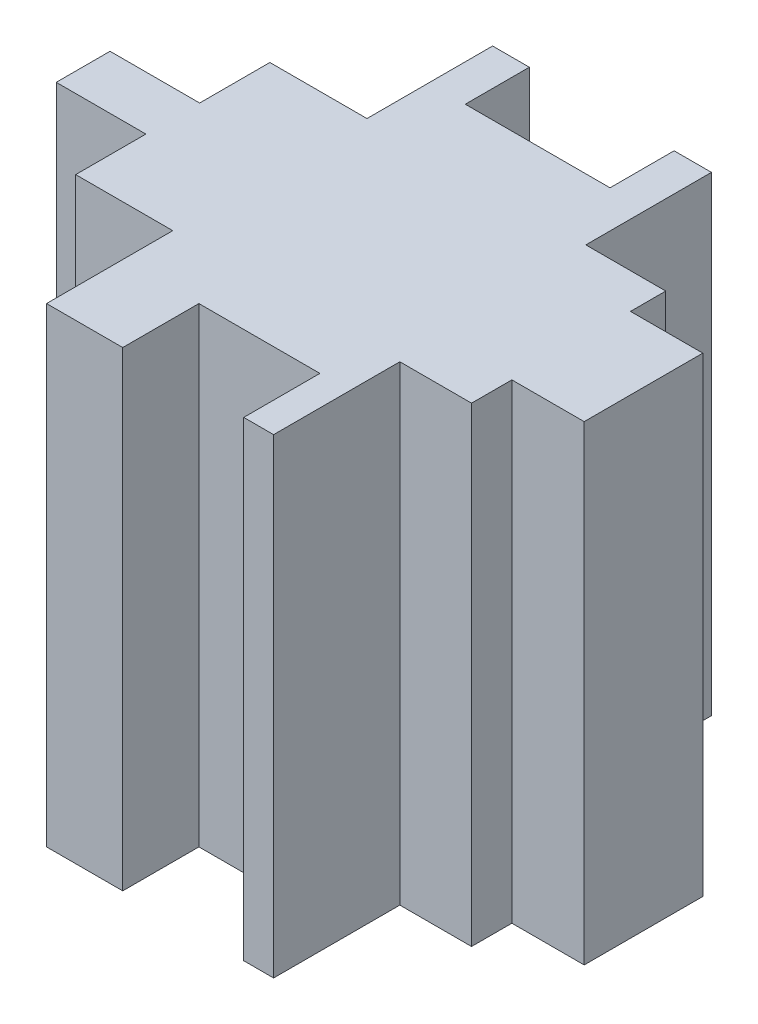
ISO-10303-21;
HEADER;
FILE_DESCRIPTION(('STEP AP214'),'2;1');
FILE_NAME('part.step','',(''),(''),'','','');
FILE_SCHEMA(('AUTOMOTIVE_DESIGN { 1 0 10303 214 1 1 1 1 }'));
ENDSEC;
DATA;
#1=APPLICATION_CONTEXT('core data for automotive mechanical design processes');
#2=APPLICATION_PROTOCOL_DEFINITION('international standard','automotive_design',2000,#1);
#3=PRODUCT_CONTEXT('',#1,'mechanical');
#4=PRODUCT('Part','Part','',(#3));
#5=PRODUCT_RELATED_PRODUCT_CATEGORY('part','',(#4));
#6=PRODUCT_DEFINITION_FORMATION('','',#4);
#7=PRODUCT_DEFINITION_CONTEXT('part definition',#1,'design');
#8=PRODUCT_DEFINITION('design','',#6,#7);
#9=PRODUCT_DEFINITION_SHAPE('','',#8);
#10=(LENGTH_UNIT() NAMED_UNIT(*) SI_UNIT(.MILLI.,.METRE.));
#11=(NAMED_UNIT(*) PLANE_ANGLE_UNIT() SI_UNIT($,.RADIAN.));
#12=(NAMED_UNIT(*) SI_UNIT($,.STERADIAN.) SOLID_ANGLE_UNIT());
#13=UNCERTAINTY_MEASURE_WITH_UNIT(LENGTH_MEASURE(1.E-05),#10,'distance_accuracy_value','');
#14=(GEOMETRIC_REPRESENTATION_CONTEXT(3) GLOBAL_UNCERTAINTY_ASSIGNED_CONTEXT((#13)) GLOBAL_UNIT_ASSIGNED_CONTEXT((#10,
#11,#12)) REPRESENTATION_CONTEXT('',''));
#15=CARTESIAN_POINT('',(0.,0.,0.));
#16=DIRECTION('',(0.,0.,1.));
#17=DIRECTION('',(1.,0.,0.));
#18=AXIS2_PLACEMENT_3D('',#15,#16,#17);
#19=CARTESIAN_POINT('',(0.,800.1,0.));
#20=DIRECTION('',(1.,0.,0.));
#21=DIRECTION('',(0.,0.,-1.));
#22=AXIS2_PLACEMENT_3D('',#19,#20,#21);
#23=PLANE('',#22);
#24=DIRECTION('',(0.,0.,1.));
#25=VECTOR('',#24,1.);
#26=CARTESIAN_POINT('',(0.,0.,0.));
#27=LINE('',#26,#25);
#28=CARTESIAN_POINT('',(0.,0.,-119.38));
#29=VERTEX_POINT('',#28);
#30=CARTESIAN_POINT('',(0.,0.,0.));
#31=VERTEX_POINT('',#30);
#32=EDGE_CURVE('E257',#29,#31,#27,.T.);
#33=ORIENTED_EDGE('',*,*,#32,.T.);
#34=DIRECTION('',(0.,-1.,0.));
#35=VECTOR('',#34,1.);
#36=CARTESIAN_POINT('',(0.,800.1,0.));
#37=LINE('',#36,#35);
#38=CARTESIAN_POINT('',(0.,800.1,0.));
#39=VERTEX_POINT('',#38);
#40=EDGE_CURVE('E11',#39,#31,#37,.T.);
#41=ORIENTED_EDGE('',*,*,#40,.F.);
#42=DIRECTION('',(0.,0.,1.));
#43=VECTOR('',#42,1.);
#44=CARTESIAN_POINT('',(0.,800.1,0.));
#45=LINE('',#44,#43);
#46=CARTESIAN_POINT('',(0.,800.1,-119.38));
#47=VERTEX_POINT('',#46);
#48=EDGE_CURVE('E315',#47,#39,#45,.T.);
#49=ORIENTED_EDGE('',*,*,#48,.F.);
#50=DIRECTION('',(0.,-1.,0.));
#51=VECTOR('',#50,1.);
#52=CARTESIAN_POINT('',(0.,800.1,-119.38));
#53=LINE('',#52,#51);
#54=EDGE_CURVE('E253',#47,#29,#53,.T.);
#55=ORIENTED_EDGE('',*,*,#54,.T.);
#56=EDGE_LOOP('',(#33,#41,#49,#55));
#57=FACE_BOUND('',#56,.T.);
#58=ADVANCED_FACE('F41',(#57),#23,.F.);
#59=CARTESIAN_POINT('',(0.,800.1,0.));
#60=DIRECTION('',(0.,0.,-1.));
#61=DIRECTION('',(-1.,0.,0.));
#62=AXIS2_PLACEMENT_3D('',#59,#60,#61);
#63=PLANE('',#62);
#64=DIRECTION('',(1.,0.,0.));
#65=VECTOR('',#64,1.);
#66=CARTESIAN_POINT('',(0.,0.,0.));
#67=LINE('',#66,#65);
#68=CARTESIAN_POINT('',(165.1,0.,0.));
#69=VERTEX_POINT('',#68);
#70=EDGE_CURVE('E260',#31,#69,#67,.T.);
#71=ORIENTED_EDGE('',*,*,#70,.T.);
#72=DIRECTION('',(0.,-1.,0.));
#73=VECTOR('',#72,1.);
#74=CARTESIAN_POINT('',(165.1,800.1,0.));
#75=LINE('',#74,#73);
#76=CARTESIAN_POINT('',(165.1,800.1,0.));
#77=VERTEX_POINT('',#76);
#78=EDGE_CURVE('E49',#77,#69,#75,.T.);
#79=ORIENTED_EDGE('',*,*,#78,.F.);
#80=DIRECTION('',(1.,0.,0.));
#81=VECTOR('',#80,1.);
#82=CARTESIAN_POINT('',(0.,800.1,0.));
#83=LINE('',#82,#81);
#84=EDGE_CURVE('E160',#39,#77,#83,.T.);
#85=ORIENTED_EDGE('',*,*,#84,.F.);
#86=ORIENTED_EDGE('',*,*,#40,.T.);
#87=EDGE_LOOP('',(#71,#79,#85,#86));
#88=FACE_BOUND('',#87,.T.);
#89=ADVANCED_FACE('F390',(#88),#63,.F.);
#90=CARTESIAN_POINT('',(165.1,800.1,85.0900000000001));
#91=DIRECTION('',(1.,0.,0.));
#92=DIRECTION('',(0.,0.,-1.));
#93=AXIS2_PLACEMENT_3D('',#90,#91,#92);
#94=PLANE('',#93);
#95=DIRECTION('',(0.,0.,1.));
#96=VECTOR('',#95,1.);
#97=CARTESIAN_POINT('',(165.1,0.,85.0900000000001));
#98=LINE('',#97,#96);
#99=CARTESIAN_POINT('',(165.1,0.,214.63));
#100=VERTEX_POINT('',#99);
#101=EDGE_CURVE('E263',#69,#100,#98,.T.);
#102=ORIENTED_EDGE('',*,*,#101,.T.);
#103=DIRECTION('',(0.,-1.,0.));
#104=VECTOR('',#103,1.);
#105=CARTESIAN_POINT('',(165.1,800.1,214.63));
#106=LINE('',#105,#104);
#107=CARTESIAN_POINT('',(165.1,800.1,214.63));
#108=VERTEX_POINT('',#107);
#109=EDGE_CURVE('E382',#108,#100,#106,.T.);
#110=ORIENTED_EDGE('',*,*,#109,.F.);
#111=DIRECTION('',(0.,0.,1.));
#112=VECTOR('',#111,1.);
#113=CARTESIAN_POINT('',(165.1,800.1,0.));
#114=LINE('',#113,#112);
#115=EDGE_CURVE('E389',#77,#108,#114,.T.);
#116=ORIENTED_EDGE('',*,*,#115,.F.);
#117=ORIENTED_EDGE('',*,*,#78,.T.);
#118=EDGE_LOOP('',(#102,#110,#116,#117));
#119=FACE_BOUND('',#118,.T.);
#120=ADVANCED_FACE('F387',(#119),#94,.F.);
#121=CARTESIAN_POINT('',(165.1,800.1,214.63));
#122=DIRECTION('',(0.,0.,-1.));
#123=DIRECTION('',(-1.,0.,0.));
#124=AXIS2_PLACEMENT_3D('',#121,#122,#123);
#125=PLANE('',#124);
#126=DIRECTION('',(1.,0.,0.));
#127=VECTOR('',#126,1.);
#128=CARTESIAN_POINT('',(165.1,0.,214.63));
#129=LINE('',#128,#127);
#130=CARTESIAN_POINT('',(294.64,0.,214.63));
#131=VERTEX_POINT('',#130);
#132=EDGE_CURVE('E265',#100,#131,#129,.T.);
#133=ORIENTED_EDGE('',*,*,#132,.T.);
#134=DIRECTION('',(0.,-1.,0.));
#135=VECTOR('',#134,1.);
#136=CARTESIAN_POINT('',(294.64,800.1,214.63));
#137=LINE('',#136,#135);
#138=CARTESIAN_POINT('',(294.64,800.1,214.63));
#139=VERTEX_POINT('',#138);
#140=EDGE_CURVE('E379',#139,#131,#137,.T.);
#141=ORIENTED_EDGE('',*,*,#140,.F.);
#142=DIRECTION('',(1.,0.,0.));
#143=VECTOR('',#142,1.);
#144=CARTESIAN_POINT('',(165.1,800.1,214.63));
#145=LINE('',#144,#143);
#146=EDGE_CURVE('E409',#108,#139,#145,.T.);
#147=ORIENTED_EDGE('',*,*,#146,.F.);
#148=ORIENTED_EDGE('',*,*,#109,.T.);
#149=EDGE_LOOP('',(#133,#141,#147,#148));
#150=FACE_BOUND('',#149,.T.);
#151=ADVANCED_FACE('F400',(#150),#125,.F.);
#152=CARTESIAN_POINT('',(294.64,800.1,85.0900000000001));
#153=DIRECTION('',(-1.,0.,0.));
#154=DIRECTION('',(0.,0.,1.));
#155=AXIS2_PLACEMENT_3D('',#152,#153,#154);
#156=PLANE('',#155);
#157=DIRECTION('',(0.,0.,-1.));
#158=VECTOR('',#157,1.);
#159=CARTESIAN_POINT('',(294.64,0.,85.0900000000001));
#160=LINE('',#159,#158);
#161=CARTESIAN_POINT('',(294.64,0.,85.0900000000001));
#162=VERTEX_POINT('',#161);
#163=EDGE_CURVE('E267',#131,#162,#160,.T.);
#164=ORIENTED_EDGE('',*,*,#163,.T.);
#165=DIRECTION('',(0.,-1.,0.));
#166=VECTOR('',#165,1.);
#167=CARTESIAN_POINT('',(294.64,800.1,85.0900000000001));
#168=LINE('',#167,#166);
#169=CARTESIAN_POINT('',(294.64,800.1,85.0900000000001));
#170=VERTEX_POINT('',#169);
#171=EDGE_CURVE('E376',#170,#162,#168,.T.);
#172=ORIENTED_EDGE('',*,*,#171,.F.);
#173=DIRECTION('',(0.,0.,-1.));
#174=VECTOR('',#173,1.);
#175=CARTESIAN_POINT('',(294.64,800.1,85.0900000000001));
#176=LINE('',#175,#174);
#177=EDGE_CURVE('E406',#139,#170,#176,.T.);
#178=ORIENTED_EDGE('',*,*,#177,.F.);
#179=ORIENTED_EDGE('',*,*,#140,.T.);
#180=EDGE_LOOP('',(#164,#172,#178,#179));
#181=FACE_BOUND('',#180,.T.);
#182=ADVANCED_FACE('F404',(#181),#156,.F.);
#183=CARTESIAN_POINT('',(294.64,800.1,85.0900000000001));
#184=DIRECTION('',(0.,0.,-1.));
#185=DIRECTION('',(-1.,0.,0.));
#186=AXIS2_PLACEMENT_3D('',#183,#184,#185);
#187=PLANE('',#186);
#188=DIRECTION('',(1.,0.,0.));
#189=VECTOR('',#188,1.);
#190=CARTESIAN_POINT('',(294.64,0.,85.0900000000001));
#191=LINE('',#190,#189);
#192=CARTESIAN_POINT('',(500.38,0.,85.09));
#193=VERTEX_POINT('',#192);
#194=EDGE_CURVE('E269',#162,#193,#191,.T.);
#195=ORIENTED_EDGE('',*,*,#194,.T.);
#196=DIRECTION('',(0.,-1.,0.));
#197=VECTOR('',#196,1.);
#198=CARTESIAN_POINT('',(500.38,800.1,85.09));
#199=LINE('',#198,#197);
#200=CARTESIAN_POINT('',(500.38,800.1,85.09));
#201=VERTEX_POINT('',#200);
#202=EDGE_CURVE('E373',#201,#193,#199,.T.);
#203=ORIENTED_EDGE('',*,*,#202,.F.);
#204=DIRECTION('',(1.,0.,0.));
#205=VECTOR('',#204,1.);
#206=CARTESIAN_POINT('',(294.64,800.1,85.0900000000001));
#207=LINE('',#206,#205);
#208=EDGE_CURVE('E408',#170,#201,#207,.T.);
#209=ORIENTED_EDGE('',*,*,#208,.F.);
#210=ORIENTED_EDGE('',*,*,#171,.T.);
#211=EDGE_LOOP('',(#195,#203,#209,#210));
#212=FACE_BOUND('',#211,.T.);
#213=ADVANCED_FACE('F567',(#212),#187,.F.);
#214=CARTESIAN_POINT('',(500.38,800.1,85.09));
#215=DIRECTION('',(1.,0.,0.));
#216=DIRECTION('',(0.,0.,-1.));
#217=AXIS2_PLACEMENT_3D('',#214,#215,#216);
#218=PLANE('',#217);
#219=DIRECTION('',(0.,0.,1.));
#220=VECTOR('',#219,1.);
#221=CARTESIAN_POINT('',(500.38,0.,85.09));
#222=LINE('',#221,#220);
#223=CARTESIAN_POINT('',(500.38,0.,214.63));
#224=VERTEX_POINT('',#223);
#225=EDGE_CURVE('E271',#193,#224,#222,.T.);
#226=ORIENTED_EDGE('',*,*,#225,.T.);
#227=DIRECTION('',(0.,-1.,0.));
#228=VECTOR('',#227,1.);
#229=CARTESIAN_POINT('',(500.38,800.1,214.63));
#230=LINE('',#229,#228);
#231=CARTESIAN_POINT('',(500.38,800.1,214.63));
#232=VERTEX_POINT('',#231);
#233=EDGE_CURVE('E370',#232,#224,#230,.T.);
#234=ORIENTED_EDGE('',*,*,#233,.F.);
#235=DIRECTION('',(0.,0.,1.));
#236=VECTOR('',#235,1.);
#237=CARTESIAN_POINT('',(500.38,800.1,85.09));
#238=LINE('',#237,#236);
#239=EDGE_CURVE('E411',#201,#232,#238,.T.);
#240=ORIENTED_EDGE('',*,*,#239,.F.);
#241=ORIENTED_EDGE('',*,*,#202,.T.);
#242=EDGE_LOOP('',(#226,#234,#240,#241));
#243=FACE_BOUND('',#242,.T.);
#244=ADVANCED_FACE('F576',(#243),#218,.F.);
#245=CARTESIAN_POINT('',(551.18,800.1,214.63));
#246=DIRECTION('',(0.,0.,-1.));
#247=DIRECTION('',(-1.,0.,0.));
#248=AXIS2_PLACEMENT_3D('',#245,#246,#247);
#249=PLANE('',#248);
#250=DIRECTION('',(1.,0.,0.));
#251=VECTOR('',#250,1.);
#252=CARTESIAN_POINT('',(551.18,0.,214.63));
#253=LINE('',#252,#251);
#254=CARTESIAN_POINT('',(551.18,0.,214.63));
#255=VERTEX_POINT('',#254);
#256=EDGE_CURVE('E273',#224,#255,#253,.T.);
#257=ORIENTED_EDGE('',*,*,#256,.T.);
#258=DIRECTION('',(0.,-1.,0.));
#259=VECTOR('',#258,1.);
#260=CARTESIAN_POINT('',(551.18,800.1,214.63));
#261=LINE('',#260,#259);
#262=CARTESIAN_POINT('',(551.18,800.1,214.63));
#263=VERTEX_POINT('',#262);
#264=EDGE_CURVE('E367',#263,#255,#261,.T.);
#265=ORIENTED_EDGE('',*,*,#264,.F.);
#266=DIRECTION('',(1.,0.,0.));
#267=VECTOR('',#266,1.);
#268=CARTESIAN_POINT('',(551.18,800.1,214.63));
#269=LINE('',#268,#267);
#270=EDGE_CURVE('E417',#232,#263,#269,.T.);
#271=ORIENTED_EDGE('',*,*,#270,.F.);
#272=ORIENTED_EDGE('',*,*,#233,.T.);
#273=EDGE_LOOP('',(#257,#265,#271,#272));
#274=FACE_BOUND('',#273,.T.);
#275=ADVANCED_FACE('F586',(#274),#249,.F.);
#276=CARTESIAN_POINT('',(551.18,800.1,0.));
#277=DIRECTION('',(-1.,0.,0.));
#278=DIRECTION('',(0.,0.,1.));
#279=AXIS2_PLACEMENT_3D('',#276,#277,#278);
#280=PLANE('',#279);
#281=DIRECTION('',(0.,0.,-1.));
#282=VECTOR('',#281,1.);
#283=CARTESIAN_POINT('',(551.18,0.,0.));
#284=LINE('',#283,#282);
#285=CARTESIAN_POINT('',(551.18,0.,0.));
#286=VERTEX_POINT('',#285);
#287=EDGE_CURVE('E276',#255,#286,#284,.T.);
#288=ORIENTED_EDGE('',*,*,#287,.T.);
#289=DIRECTION('',(0.,-1.,0.));
#290=VECTOR('',#289,1.);
#291=CARTESIAN_POINT('',(551.18,800.1,0.));
#292=LINE('',#291,#290);
#293=CARTESIAN_POINT('',(551.18,800.1,0.));
#294=VERTEX_POINT('',#293);
#295=EDGE_CURVE('E364',#294,#286,#292,.T.);
#296=ORIENTED_EDGE('',*,*,#295,.F.);
#297=DIRECTION('',(0.,0.,-1.));
#298=VECTOR('',#297,1.);
#299=CARTESIAN_POINT('',(551.18,800.1,85.09));
#300=LINE('',#299,#298);
#301=EDGE_CURVE('E419',#263,#294,#300,.T.);
#302=ORIENTED_EDGE('',*,*,#301,.F.);
#303=ORIENTED_EDGE('',*,*,#264,.T.);
#304=EDGE_LOOP('',(#288,#296,#302,#303));
#305=FACE_BOUND('',#304,.T.);
#306=ADVANCED_FACE('F596',(#305),#280,.F.);
#307=CARTESIAN_POINT('',(551.18,800.1,0.));
#308=DIRECTION('',(0.,0.,-1.));
#309=DIRECTION('',(-1.,0.,0.));
#310=AXIS2_PLACEMENT_3D('',#307,#308,#309);
#311=PLANE('',#310);
#312=DIRECTION('',(1.,0.,0.));
#313=VECTOR('',#312,1.);
#314=CARTESIAN_POINT('',(551.18,0.,0.));
#315=LINE('',#314,#313);
#316=CARTESIAN_POINT('',(673.1,0.,0.));
#317=VERTEX_POINT('',#316);
#318=EDGE_CURVE('E278',#286,#317,#315,.T.);
#319=ORIENTED_EDGE('',*,*,#318,.T.);
#320=DIRECTION('',(0.,-1.,0.));
#321=VECTOR('',#320,1.);
#322=CARTESIAN_POINT('',(673.1,800.1,0.));
#323=LINE('',#322,#321);
#324=CARTESIAN_POINT('',(673.1,800.1,0.));
#325=VERTEX_POINT('',#324);
#326=EDGE_CURVE('E361',#325,#317,#323,.T.);
#327=ORIENTED_EDGE('',*,*,#326,.F.);
#328=DIRECTION('',(1.,0.,0.));
#329=VECTOR('',#328,1.);
#330=CARTESIAN_POINT('',(551.18,800.1,0.));
#331=LINE('',#330,#329);
#332=EDGE_CURVE('E421',#294,#325,#331,.T.);
#333=ORIENTED_EDGE('',*,*,#332,.F.);
#334=ORIENTED_EDGE('',*,*,#295,.T.);
#335=EDGE_LOOP('',(#319,#327,#333,#334));
#336=FACE_BOUND('',#335,.T.);
#337=ADVANCED_FACE('F607',(#336),#311,.F.);
#338=CARTESIAN_POINT('',(673.1,800.1,0.));
#339=DIRECTION('',(-1.,0.,0.));
#340=DIRECTION('',(0.,0.,1.));
#341=AXIS2_PLACEMENT_3D('',#338,#339,#340);
#342=PLANE('',#341);
#343=DIRECTION('',(0.,0.,-1.));
#344=VECTOR('',#343,1.);
#345=CARTESIAN_POINT('',(673.1,0.,0.));
#346=LINE('',#345,#344);
#347=CARTESIAN_POINT('',(673.1,0.,-68.58));
#348=VERTEX_POINT('',#347);
#349=EDGE_CURVE('E280',#317,#348,#346,.T.);
#350=ORIENTED_EDGE('',*,*,#349,.T.);
#351=DIRECTION('',(0.,-1.,0.));
#352=VECTOR('',#351,1.);
#353=CARTESIAN_POINT('',(673.1,800.1,-68.58));
#354=LINE('',#353,#352);
#355=CARTESIAN_POINT('',(673.1,800.1,-68.58));
#356=VERTEX_POINT('',#355);
#357=EDGE_CURVE('E358',#356,#348,#354,.T.);
#358=ORIENTED_EDGE('',*,*,#357,.F.);
#359=DIRECTION('',(0.,0.,-1.));
#360=VECTOR('',#359,1.);
#361=CARTESIAN_POINT('',(673.1,800.1,0.));
#362=LINE('',#361,#360);
#363=EDGE_CURVE('E423',#325,#356,#362,.T.);
#364=ORIENTED_EDGE('',*,*,#363,.F.);
#365=ORIENTED_EDGE('',*,*,#326,.T.);
#366=EDGE_LOOP('',(#350,#358,#364,#365));
#367=FACE_BOUND('',#366,.T.);
#368=ADVANCED_FACE('F617',(#367),#342,.F.);
#369=CARTESIAN_POINT('',(673.1,800.1,-68.58));
#370=DIRECTION('',(0.,0.,-1.));
#371=DIRECTION('',(-1.,0.,0.));
#372=AXIS2_PLACEMENT_3D('',#369,#370,#371);
#373=PLANE('',#372);
#374=DIRECTION('',(1.,0.,0.));
#375=VECTOR('',#374,1.);
#376=CARTESIAN_POINT('',(673.1,0.,-68.58));
#377=LINE('',#376,#375);
#378=CARTESIAN_POINT('',(796.036,0.,-68.58));
#379=VERTEX_POINT('',#378);
#380=EDGE_CURVE('E282',#348,#379,#377,.T.);
#381=ORIENTED_EDGE('',*,*,#380,.T.);
#382=DIRECTION('',(0.,-1.,0.));
#383=VECTOR('',#382,1.);
#384=CARTESIAN_POINT('',(796.036,800.1,-68.58));
#385=LINE('',#384,#383);
#386=CARTESIAN_POINT('',(796.036,800.1,-68.58));
#387=VERTEX_POINT('',#386);
#388=EDGE_CURVE('E355',#387,#379,#385,.T.);
#389=ORIENTED_EDGE('',*,*,#388,.F.);
#390=DIRECTION('',(1.,0.,0.));
#391=VECTOR('',#390,1.);
#392=CARTESIAN_POINT('',(673.1,800.1,-68.58));
#393=LINE('',#392,#391);
#394=EDGE_CURVE('E425',#356,#387,#393,.T.);
#395=ORIENTED_EDGE('',*,*,#394,.F.);
#396=ORIENTED_EDGE('',*,*,#357,.T.);
#397=EDGE_LOOP('',(#381,#389,#395,#396));
#398=FACE_BOUND('',#397,.T.);
#399=ADVANCED_FACE('F627',(#398),#373,.F.);
#400=CARTESIAN_POINT('',(796.036,800.1,-270.256));
#401=DIRECTION('',(-1.,0.,0.));
#402=DIRECTION('',(0.,0.,1.));
#403=AXIS2_PLACEMENT_3D('',#400,#401,#402);
#404=PLANE('',#403);
#405=DIRECTION('',(0.,0.,-1.));
#406=VECTOR('',#405,1.);
#407=CARTESIAN_POINT('',(796.036,0.,-270.256));
#408=LINE('',#407,#406);
#409=CARTESIAN_POINT('',(796.036,0.,-270.256));
#410=VERTEX_POINT('',#409);
#411=EDGE_CURVE('E284',#379,#410,#408,.T.);
#412=ORIENTED_EDGE('',*,*,#411,.T.);
#413=DIRECTION('',(0.,-1.,0.));
#414=VECTOR('',#413,1.);
#415=CARTESIAN_POINT('',(796.036,800.1,-270.256));
#416=LINE('',#415,#414);
#417=CARTESIAN_POINT('',(796.036,800.1,-270.256));
#418=VERTEX_POINT('',#417);
#419=EDGE_CURVE('E352',#418,#410,#416,.T.);
#420=ORIENTED_EDGE('',*,*,#419,.F.);
#421=DIRECTION('',(0.,0.,-1.));
#422=VECTOR('',#421,1.);
#423=CARTESIAN_POINT('',(796.036,800.1,-270.256));
#424=LINE('',#423,#422);
#425=EDGE_CURVE('E427',#387,#418,#424,.T.);
#426=ORIENTED_EDGE('',*,*,#425,.F.);
#427=ORIENTED_EDGE('',*,*,#388,.T.);
#428=EDGE_LOOP('',(#412,#420,#426,#427));
#429=FACE_BOUND('',#428,.T.);
#430=ADVANCED_FACE('F637',(#429),#404,.F.);
#431=CARTESIAN_POINT('',(673.1,800.1,-270.256));
#432=DIRECTION('',(0.,0.,1.));
#433=DIRECTION('',(1.,0.,0.));
#434=AXIS2_PLACEMENT_3D('',#431,#432,#433);
#435=PLANE('',#434);
#436=DIRECTION('',(-1.,0.,0.));
#437=VECTOR('',#436,1.);
#438=CARTESIAN_POINT('',(673.1,0.,-270.256));
#439=LINE('',#438,#437);
#440=CARTESIAN_POINT('',(673.1,0.,-270.256));
#441=VERTEX_POINT('',#440);
#442=EDGE_CURVE('E286',#410,#441,#439,.T.);
#443=ORIENTED_EDGE('',*,*,#442,.T.);
#444=DIRECTION('',(0.,-1.,0.));
#445=VECTOR('',#444,1.);
#446=CARTESIAN_POINT('',(673.1,800.1,-270.256));
#447=LINE('',#446,#445);
#448=CARTESIAN_POINT('',(673.1,800.1,-270.256));
#449=VERTEX_POINT('',#448);
#450=EDGE_CURVE('E349',#449,#441,#447,.T.);
#451=ORIENTED_EDGE('',*,*,#450,.F.);
#452=DIRECTION('',(-1.,0.,0.));
#453=VECTOR('',#452,1.);
#454=CARTESIAN_POINT('',(673.1,800.1,-270.256));
#455=LINE('',#454,#453);
#456=EDGE_CURVE('E429',#418,#449,#455,.T.);
#457=ORIENTED_EDGE('',*,*,#456,.F.);
#458=ORIENTED_EDGE('',*,*,#419,.T.);
#459=EDGE_LOOP('',(#443,#451,#457,#458));
#460=FACE_BOUND('',#459,.T.);
#461=ADVANCED_FACE('F647',(#460),#435,.F.);
#462=CARTESIAN_POINT('',(673.1,800.1,-270.256));
#463=DIRECTION('',(-1.,0.,0.));
#464=DIRECTION('',(0.,0.,1.));
#465=AXIS2_PLACEMENT_3D('',#462,#463,#464);
#466=PLANE('',#465);
#467=DIRECTION('',(0.,0.,-1.));
#468=VECTOR('',#467,1.);
#469=CARTESIAN_POINT('',(673.1,0.,-270.256));
#470=LINE('',#469,#468);
#471=CARTESIAN_POINT('',(673.1,0.,-330.2));
#472=VERTEX_POINT('',#471);
#473=EDGE_CURVE('E288',#441,#472,#470,.T.);
#474=ORIENTED_EDGE('',*,*,#473,.T.);
#475=DIRECTION('',(0.,-1.,0.));
#476=VECTOR('',#475,1.);
#477=CARTESIAN_POINT('',(673.1,800.1,-330.2));
#478=LINE('',#477,#476);
#479=CARTESIAN_POINT('',(673.1,800.1,-330.2));
#480=VERTEX_POINT('',#479);
#481=EDGE_CURVE('E346',#480,#472,#478,.T.);
#482=ORIENTED_EDGE('',*,*,#481,.F.);
#483=DIRECTION('',(0.,0.,-1.));
#484=VECTOR('',#483,1.);
#485=CARTESIAN_POINT('',(673.1,800.1,-270.256));
#486=LINE('',#485,#484);
#487=EDGE_CURVE('E431',#449,#480,#486,.T.);
#488=ORIENTED_EDGE('',*,*,#487,.F.);
#489=ORIENTED_EDGE('',*,*,#450,.T.);
#490=EDGE_LOOP('',(#474,#482,#488,#489));
#491=FACE_BOUND('',#490,.T.);
#492=ADVANCED_FACE('F657',(#491),#466,.F.);
#493=CARTESIAN_POINT('',(537.21,800.1,-330.2));
#494=DIRECTION('',(0.,0.,1.));
#495=DIRECTION('',(1.,0.,0.));
#496=AXIS2_PLACEMENT_3D('',#493,#494,#495);
#497=PLANE('',#496);
#498=DIRECTION('',(-1.,0.,0.));
#499=VECTOR('',#498,1.);
#500=CARTESIAN_POINT('',(537.21,0.,-330.2));
#501=LINE('',#500,#499);
#502=CARTESIAN_POINT('',(537.21,0.,-330.2));
#503=VERTEX_POINT('',#502);
#504=EDGE_CURVE('E290',#472,#503,#501,.T.);
#505=ORIENTED_EDGE('',*,*,#504,.T.);
#506=DIRECTION('',(0.,-1.,0.));
#507=VECTOR('',#506,1.);
#508=CARTESIAN_POINT('',(537.21,800.1,-330.2));
#509=LINE('',#508,#507);
#510=CARTESIAN_POINT('',(537.21,800.1,-330.2));
#511=VERTEX_POINT('',#510);
#512=EDGE_CURVE('E343',#511,#503,#509,.T.);
#513=ORIENTED_EDGE('',*,*,#512,.F.);
#514=DIRECTION('',(-1.,0.,0.));
#515=VECTOR('',#514,1.);
#516=CARTESIAN_POINT('',(537.21,800.1,-330.2));
#517=LINE('',#516,#515);
#518=EDGE_CURVE('E433',#480,#511,#517,.T.);
#519=ORIENTED_EDGE('',*,*,#518,.F.);
#520=ORIENTED_EDGE('',*,*,#481,.T.);
#521=EDGE_LOOP('',(#505,#513,#519,#520));
#522=FACE_BOUND('',#521,.T.);
#523=ADVANCED_FACE('F667',(#522),#497,.F.);
#524=CARTESIAN_POINT('',(537.21,800.1,-434.848));
#525=DIRECTION('',(-1.,0.,0.));
#526=DIRECTION('',(0.,0.,1.));
#527=AXIS2_PLACEMENT_3D('',#524,#525,#526);
#528=PLANE('',#527);
#529=DIRECTION('',(0.,0.,-1.));
#530=VECTOR('',#529,1.);
#531=CARTESIAN_POINT('',(537.21,0.,-434.848));
#532=LINE('',#531,#530);
#533=CARTESIAN_POINT('',(537.21,0.,-543.814));
#534=VERTEX_POINT('',#533);
#535=EDGE_CURVE('E293',#503,#534,#532,.T.);
#536=ORIENTED_EDGE('',*,*,#535,.T.);
#537=DIRECTION('',(0.,-1.,0.));
#538=VECTOR('',#537,1.);
#539=CARTESIAN_POINT('',(537.21,800.1,-543.814));
#540=LINE('',#539,#538);
#541=CARTESIAN_POINT('',(537.21,800.1,-543.814));
#542=VERTEX_POINT('',#541);
#543=EDGE_CURVE('E340',#542,#534,#540,.T.);
#544=ORIENTED_EDGE('',*,*,#543,.F.);
#545=DIRECTION('',(0.,0.,-1.));
#546=VECTOR('',#545,1.);
#547=CARTESIAN_POINT('',(537.21,800.1,-330.2));
#548=LINE('',#547,#546);
#549=EDGE_CURVE('E435',#511,#542,#548,.T.);
#550=ORIENTED_EDGE('',*,*,#549,.F.);
#551=ORIENTED_EDGE('',*,*,#512,.T.);
#552=EDGE_LOOP('',(#536,#544,#550,#551));
#553=FACE_BOUND('',#552,.T.);
#554=ADVANCED_FACE('F677',(#553),#528,.F.);
#555=CARTESIAN_POINT('',(537.21,800.1,-543.814));
#556=DIRECTION('',(0.,0.,1.));
#557=DIRECTION('',(1.,0.,0.));
#558=AXIS2_PLACEMENT_3D('',#555,#556,#557);
#559=PLANE('',#558);
#560=DIRECTION('',(-1.,0.,0.));
#561=VECTOR('',#560,1.);
#562=CARTESIAN_POINT('',(537.21,0.,-543.814));
#563=LINE('',#562,#561);
#564=CARTESIAN_POINT('',(473.71,0.,-543.814));
#565=VERTEX_POINT('',#564);
#566=EDGE_CURVE('E295',#534,#565,#563,.T.);
#567=ORIENTED_EDGE('',*,*,#566,.T.);
#568=DIRECTION('',(0.,-1.,0.));
#569=VECTOR('',#568,1.);
#570=CARTESIAN_POINT('',(473.71,800.1,-543.814));
#571=LINE('',#570,#569);
#572=CARTESIAN_POINT('',(473.71,800.1,-543.814));
#573=VERTEX_POINT('',#572);
#574=EDGE_CURVE('E337',#573,#565,#571,.T.);
#575=ORIENTED_EDGE('',*,*,#574,.F.);
#576=DIRECTION('',(-1.,0.,0.));
#577=VECTOR('',#576,1.);
#578=CARTESIAN_POINT('',(537.21,800.1,-543.814));
#579=LINE('',#578,#577);
#580=EDGE_CURVE('E437',#542,#573,#579,.T.);
#581=ORIENTED_EDGE('',*,*,#580,.F.);
#582=ORIENTED_EDGE('',*,*,#543,.T.);
#583=EDGE_LOOP('',(#567,#575,#581,#582));
#584=FACE_BOUND('',#583,.T.);
#585=ADVANCED_FACE('F688',(#584),#559,.F.);
#586=CARTESIAN_POINT('',(473.71,800.1,-434.848));
#587=DIRECTION('',(1.,0.,0.));
#588=DIRECTION('',(0.,0.,-1.));
#589=AXIS2_PLACEMENT_3D('',#586,#587,#588);
#590=PLANE('',#589);
#591=DIRECTION('',(0.,0.,1.));
#592=VECTOR('',#591,1.);
#593=CARTESIAN_POINT('',(473.71,0.,-434.848));
#594=LINE('',#593,#592);
#595=CARTESIAN_POINT('',(473.71,0.,-434.848));
#596=VERTEX_POINT('',#595);
#597=EDGE_CURVE('E297',#565,#596,#594,.T.);
#598=ORIENTED_EDGE('',*,*,#597,.T.);
#599=DIRECTION('',(0.,-1.,0.));
#600=VECTOR('',#599,1.);
#601=CARTESIAN_POINT('',(473.71,800.1,-434.848));
#602=LINE('',#601,#600);
#603=CARTESIAN_POINT('',(473.71,800.1,-434.848));
#604=VERTEX_POINT('',#603);
#605=EDGE_CURVE('E334',#604,#596,#602,.T.);
#606=ORIENTED_EDGE('',*,*,#605,.F.);
#607=DIRECTION('',(0.,0.,1.));
#608=VECTOR('',#607,1.);
#609=CARTESIAN_POINT('',(473.71,800.1,-434.848));
#610=LINE('',#609,#608);
#611=EDGE_CURVE('E439',#573,#604,#610,.T.);
#612=ORIENTED_EDGE('',*,*,#611,.F.);
#613=ORIENTED_EDGE('',*,*,#574,.T.);
#614=EDGE_LOOP('',(#598,#606,#612,#613));
#615=FACE_BOUND('',#614,.T.);
#616=ADVANCED_FACE('F698',(#615),#590,.F.);
#617=CARTESIAN_POINT('',(227.584,800.1,-434.848));
#618=DIRECTION('',(0.,0.,1.));
#619=DIRECTION('',(1.,0.,0.));
#620=AXIS2_PLACEMENT_3D('',#617,#618,#619);
#621=PLANE('',#620);
#622=DIRECTION('',(-1.,0.,0.));
#623=VECTOR('',#622,1.);
#624=CARTESIAN_POINT('',(227.584,0.,-434.848));
#625=LINE('',#624,#623);
#626=CARTESIAN_POINT('',(227.584,0.,-434.848));
#627=VERTEX_POINT('',#626);
#628=EDGE_CURVE('E299',#596,#627,#625,.T.);
#629=ORIENTED_EDGE('',*,*,#628,.T.);
#630=DIRECTION('',(0.,-1.,0.));
#631=VECTOR('',#630,1.);
#632=CARTESIAN_POINT('',(227.584,800.1,-434.848));
#633=LINE('',#632,#631);
#634=CARTESIAN_POINT('',(227.584,800.1,-434.848));
#635=VERTEX_POINT('',#634);
#636=EDGE_CURVE('E331',#635,#627,#633,.T.);
#637=ORIENTED_EDGE('',*,*,#636,.F.);
#638=DIRECTION('',(-1.,0.,0.));
#639=VECTOR('',#638,1.);
#640=CARTESIAN_POINT('',(227.584,800.1,-434.848));
#641=LINE('',#640,#639);
#642=EDGE_CURVE('E441',#604,#635,#641,.T.);
#643=ORIENTED_EDGE('',*,*,#642,.F.);
#644=ORIENTED_EDGE('',*,*,#605,.T.);
#645=EDGE_LOOP('',(#629,#637,#643,#644));
#646=FACE_BOUND('',#645,.T.);
#647=ADVANCED_FACE('F708',(#646),#621,.F.);
#648=CARTESIAN_POINT('',(227.584,800.1,-434.848));
#649=DIRECTION('',(-1.,0.,0.));
#650=DIRECTION('',(0.,0.,1.));
#651=AXIS2_PLACEMENT_3D('',#648,#649,#650);
#652=PLANE('',#651);
#653=DIRECTION('',(0.,0.,-1.));
#654=VECTOR('',#653,1.);
#655=CARTESIAN_POINT('',(227.584,0.,-434.848));
#656=LINE('',#655,#654);
#657=CARTESIAN_POINT('',(227.584,0.,-543.814));
#658=VERTEX_POINT('',#657);
#659=EDGE_CURVE('E301',#627,#658,#656,.T.);
#660=ORIENTED_EDGE('',*,*,#659,.T.);
#661=DIRECTION('',(0.,-1.,0.));
#662=VECTOR('',#661,1.);
#663=CARTESIAN_POINT('',(227.584,800.1,-543.814));
#664=LINE('',#663,#662);
#665=CARTESIAN_POINT('',(227.584,800.1,-543.814));
#666=VERTEX_POINT('',#665);
#667=EDGE_CURVE('E328',#666,#658,#664,.T.);
#668=ORIENTED_EDGE('',*,*,#667,.F.);
#669=DIRECTION('',(0.,0.,-1.));
#670=VECTOR('',#669,1.);
#671=CARTESIAN_POINT('',(227.584,800.1,-434.848));
#672=LINE('',#671,#670);
#673=EDGE_CURVE('E443',#635,#666,#672,.T.);
#674=ORIENTED_EDGE('',*,*,#673,.F.);
#675=ORIENTED_EDGE('',*,*,#636,.T.);
#676=EDGE_LOOP('',(#660,#668,#674,#675));
#677=FACE_BOUND('',#676,.T.);
#678=ADVANCED_FACE('F476',(#677),#652,.F.);
#679=CARTESIAN_POINT('',(165.1,800.1,-543.814));
#680=DIRECTION('',(0.,0.,1.));
#681=DIRECTION('',(1.,0.,0.));
#682=AXIS2_PLACEMENT_3D('',#679,#680,#681);
#683=PLANE('',#682);
#684=DIRECTION('',(-1.,0.,0.));
#685=VECTOR('',#684,1.);
#686=CARTESIAN_POINT('',(165.1,0.,-543.814));
#687=LINE('',#686,#685);
#688=CARTESIAN_POINT('',(165.1,0.,-543.814));
#689=VERTEX_POINT('',#688);
#690=EDGE_CURVE('E303',#658,#689,#687,.T.);
#691=ORIENTED_EDGE('',*,*,#690,.T.);
#692=DIRECTION('',(0.,-1.,0.));
#693=VECTOR('',#692,1.);
#694=CARTESIAN_POINT('',(165.1,800.1,-543.814));
#695=LINE('',#694,#693);
#696=CARTESIAN_POINT('',(165.1,800.1,-543.814));
#697=VERTEX_POINT('',#696);
#698=EDGE_CURVE('E325',#697,#689,#695,.T.);
#699=ORIENTED_EDGE('',*,*,#698,.F.);
#700=DIRECTION('',(-1.,0.,0.));
#701=VECTOR('',#700,1.);
#702=CARTESIAN_POINT('',(165.1,800.1,-543.814));
#703=LINE('',#702,#701);
#704=EDGE_CURVE('E445',#666,#697,#703,.T.);
#705=ORIENTED_EDGE('',*,*,#704,.F.);
#706=ORIENTED_EDGE('',*,*,#667,.T.);
#707=EDGE_LOOP('',(#691,#699,#705,#706));
#708=FACE_BOUND('',#707,.T.);
#709=ADVANCED_FACE('F465',(#708),#683,.F.);
#710=CARTESIAN_POINT('',(165.1,800.1,-330.2));
#711=DIRECTION('',(1.,0.,0.));
#712=DIRECTION('',(0.,0.,-1.));
#713=AXIS2_PLACEMENT_3D('',#710,#711,#712);
#714=PLANE('',#713);
#715=DIRECTION('',(0.,0.,1.));
#716=VECTOR('',#715,1.);
#717=CARTESIAN_POINT('',(165.1,0.,-330.2));
#718=LINE('',#717,#716);
#719=CARTESIAN_POINT('',(165.1,0.,-330.2));
#720=VERTEX_POINT('',#719);
#721=EDGE_CURVE('E306',#689,#720,#718,.T.);
#722=ORIENTED_EDGE('',*,*,#721,.T.);
#723=DIRECTION('',(0.,-1.,0.));
#724=VECTOR('',#723,1.);
#725=CARTESIAN_POINT('',(165.1,800.1,-330.2));
#726=LINE('',#725,#724);
#727=CARTESIAN_POINT('',(165.1,800.1,-330.2));
#728=VERTEX_POINT('',#727);
#729=EDGE_CURVE('E322',#728,#720,#726,.T.);
#730=ORIENTED_EDGE('',*,*,#729,.F.);
#731=DIRECTION('',(0.,0.,1.));
#732=VECTOR('',#731,1.);
#733=CARTESIAN_POINT('',(165.1,800.1,-434.848));
#734=LINE('',#733,#732);
#735=EDGE_CURVE('E447',#697,#728,#734,.T.);
#736=ORIENTED_EDGE('',*,*,#735,.F.);
#737=ORIENTED_EDGE('',*,*,#698,.T.);
#738=EDGE_LOOP('',(#722,#730,#736,#737));
#739=FACE_BOUND('',#738,.T.);
#740=ADVANCED_FACE('F468',(#739),#714,.F.);
#741=CARTESIAN_POINT('',(0.,800.1,-330.2));
#742=DIRECTION('',(0.,0.,1.));
#743=DIRECTION('',(1.,0.,0.));
#744=AXIS2_PLACEMENT_3D('',#741,#742,#743);
#745=PLANE('',#744);
#746=DIRECTION('',(-1.,0.,0.));
#747=VECTOR('',#746,1.);
#748=CARTESIAN_POINT('',(0.,0.,-330.2));
#749=LINE('',#748,#747);
#750=CARTESIAN_POINT('',(0.,0.,-330.2));
#751=VERTEX_POINT('',#750);
#752=EDGE_CURVE('E308',#720,#751,#749,.T.);
#753=ORIENTED_EDGE('',*,*,#752,.T.);
#754=DIRECTION('',(0.,-1.,0.));
#755=VECTOR('',#754,1.);
#756=CARTESIAN_POINT('',(0.,800.1,-330.2));
#757=LINE('',#756,#755);
#758=CARTESIAN_POINT('',(0.,800.1,-330.2));
#759=VERTEX_POINT('',#758);
#760=EDGE_CURVE('E319',#759,#751,#757,.T.);
#761=ORIENTED_EDGE('',*,*,#760,.F.);
#762=DIRECTION('',(-1.,0.,0.));
#763=VECTOR('',#762,1.);
#764=CARTESIAN_POINT('',(0.,800.1,-330.2));
#765=LINE('',#764,#763);
#766=EDGE_CURVE('E449',#728,#759,#765,.T.);
#767=ORIENTED_EDGE('',*,*,#766,.F.);
#768=ORIENTED_EDGE('',*,*,#729,.T.);
#769=EDGE_LOOP('',(#753,#761,#767,#768));
#770=FACE_BOUND('',#769,.T.);
#771=ADVANCED_FACE('F455',(#770),#745,.F.);
#772=CARTESIAN_POINT('',(0.,800.1,-210.82));
#773=DIRECTION('',(1.,0.,0.));
#774=DIRECTION('',(0.,0.,-1.));
#775=AXIS2_PLACEMENT_3D('',#772,#773,#774);
#776=PLANE('',#775);
#777=DIRECTION('',(0.,0.,1.));
#778=VECTOR('',#777,1.);
#779=CARTESIAN_POINT('',(0.,0.,-210.82));
#780=LINE('',#779,#778);
#781=CARTESIAN_POINT('',(0.,0.,-210.82));
#782=VERTEX_POINT('',#781);
#783=EDGE_CURVE('E310',#751,#782,#780,.T.);
#784=ORIENTED_EDGE('',*,*,#783,.T.);
#785=DIRECTION('',(0.,-1.,0.));
#786=VECTOR('',#785,1.);
#787=CARTESIAN_POINT('',(0.,800.1,-210.82));
#788=LINE('',#787,#786);
#789=CARTESIAN_POINT('',(0.,800.1,-210.82));
#790=VERTEX_POINT('',#789);
#791=EDGE_CURVE('E248',#790,#782,#788,.T.);
#792=ORIENTED_EDGE('',*,*,#791,.F.);
#793=DIRECTION('',(0.,0.,1.));
#794=VECTOR('',#793,1.);
#795=CARTESIAN_POINT('',(0.,800.1,-210.82));
#796=LINE('',#795,#794);
#797=EDGE_CURVE('E239',#759,#790,#796,.T.);
#798=ORIENTED_EDGE('',*,*,#797,.F.);
#799=ORIENTED_EDGE('',*,*,#760,.T.);
#800=EDGE_LOOP('',(#784,#792,#798,#799));
#801=FACE_BOUND('',#800,.T.);
#802=ADVANCED_FACE('F459',(#801),#776,.F.);
#803=CARTESIAN_POINT('',(0.,800.1,-210.82));
#804=DIRECTION('',(0.,0.,1.));
#805=DIRECTION('',(1.,0.,0.));
#806=AXIS2_PLACEMENT_3D('',#803,#804,#805);
#807=PLANE('',#806);
#808=DIRECTION('',(-1.,0.,0.));
#809=VECTOR('',#808,1.);
#810=CARTESIAN_POINT('',(0.,0.,-210.82));
#811=LINE('',#810,#809);
#812=CARTESIAN_POINT('',(-152.4,0.,-210.82));
#813=VERTEX_POINT('',#812);
#814=EDGE_CURVE('E247',#782,#813,#811,.T.);
#815=ORIENTED_EDGE('',*,*,#814,.T.);
#816=DIRECTION('',(0.,-1.,0.));
#817=VECTOR('',#816,1.);
#818=CARTESIAN_POINT('',(-152.4,800.1,-210.82));
#819=LINE('',#818,#817);
#820=CARTESIAN_POINT('',(-152.4,800.1,-210.82));
#821=VERTEX_POINT('',#820);
#822=EDGE_CURVE('E244',#821,#813,#819,.T.);
#823=ORIENTED_EDGE('',*,*,#822,.F.);
#824=DIRECTION('',(-1.,0.,0.));
#825=VECTOR('',#824,1.);
#826=CARTESIAN_POINT('',(0.,800.1,-210.82));
#827=LINE('',#826,#825);
#828=EDGE_CURVE('E233',#790,#821,#827,.T.);
#829=ORIENTED_EDGE('',*,*,#828,.F.);
#830=ORIENTED_EDGE('',*,*,#791,.T.);
#831=EDGE_LOOP('',(#815,#823,#829,#830));
#832=FACE_BOUND('',#831,.T.);
#833=ADVANCED_FACE('F245',(#832),#807,.F.);
#834=CARTESIAN_POINT('',(-152.4,800.1,-119.38));
#835=DIRECTION('',(1.,0.,0.));
#836=DIRECTION('',(0.,0.,-1.));
#837=AXIS2_PLACEMENT_3D('',#834,#835,#836);
#838=PLANE('',#837);
#839=DIRECTION('',(0.,0.,1.));
#840=VECTOR('',#839,1.);
#841=CARTESIAN_POINT('',(-152.4,0.,-119.38));
#842=LINE('',#841,#840);
#843=CARTESIAN_POINT('',(-152.4,0.,-119.38));
#844=VERTEX_POINT('',#843);
#845=EDGE_CURVE('E146',#813,#844,#842,.T.);
#846=ORIENTED_EDGE('',*,*,#845,.T.);
#847=DIRECTION('',(0.,-1.,0.));
#848=VECTOR('',#847,1.);
#849=CARTESIAN_POINT('',(-152.4,800.1,-119.38));
#850=LINE('',#849,#848);
#851=CARTESIAN_POINT('',(-152.4,800.1,-119.38));
#852=VERTEX_POINT('',#851);
#853=EDGE_CURVE('E249',#852,#844,#850,.T.);
#854=ORIENTED_EDGE('',*,*,#853,.F.);
#855=DIRECTION('',(0.,0.,1.));
#856=VECTOR('',#855,1.);
#857=CARTESIAN_POINT('',(-152.4,800.1,-119.38));
#858=LINE('',#857,#856);
#859=EDGE_CURVE('E237',#821,#852,#858,.T.);
#860=ORIENTED_EDGE('',*,*,#859,.F.);
#861=ORIENTED_EDGE('',*,*,#822,.T.);
#862=EDGE_LOOP('',(#846,#854,#860,#861));
#863=FACE_BOUND('',#862,.T.);
#864=ADVANCED_FACE('F251',(#863),#838,.F.);
#865=CARTESIAN_POINT('',(0.,800.1,-119.38));
#866=DIRECTION('',(0.,0.,-1.));
#867=DIRECTION('',(-1.,0.,0.));
#868=AXIS2_PLACEMENT_3D('',#865,#866,#867);
#869=PLANE('',#868);
#870=DIRECTION('',(1.,0.,0.));
#871=VECTOR('',#870,1.);
#872=CARTESIAN_POINT('',(0.,0.,-119.38));
#873=LINE('',#872,#871);
#874=EDGE_CURVE('E152',#844,#29,#873,.T.);
#875=ORIENTED_EDGE('',*,*,#874,.T.);
#876=ORIENTED_EDGE('',*,*,#54,.F.);
#877=DIRECTION('',(1.,0.,0.));
#878=VECTOR('',#877,1.);
#879=CARTESIAN_POINT('',(0.,800.1,-119.38));
#880=LINE('',#879,#878);
#881=EDGE_CURVE('E57',#852,#47,#880,.T.);
#882=ORIENTED_EDGE('',*,*,#881,.F.);
#883=ORIENTED_EDGE('',*,*,#853,.T.);
#884=EDGE_LOOP('',(#875,#876,#882,#883));
#885=FACE_BOUND('',#884,.T.);
#886=ADVANCED_FACE('F484',(#885),#869,.F.);
#887=CARTESIAN_POINT('',(0.,800.1,0.));
#888=DIRECTION('',(0.,1.,0.));
#889=DIRECTION('',(0.,0.,1.));
#890=AXIS2_PLACEMENT_3D('',#887,#888,#889);
#891=PLANE('',#890);
#892=ORIENTED_EDGE('',*,*,#48,.T.);
#893=ORIENTED_EDGE('',*,*,#84,.T.);
#894=ORIENTED_EDGE('',*,*,#115,.T.);
#895=ORIENTED_EDGE('',*,*,#146,.T.);
#896=ORIENTED_EDGE('',*,*,#177,.T.);
#897=ORIENTED_EDGE('',*,*,#208,.T.);
#898=ORIENTED_EDGE('',*,*,#239,.T.);
#899=ORIENTED_EDGE('',*,*,#270,.T.);
#900=ORIENTED_EDGE('',*,*,#301,.T.);
#901=ORIENTED_EDGE('',*,*,#332,.T.);
#902=ORIENTED_EDGE('',*,*,#363,.T.);
#903=ORIENTED_EDGE('',*,*,#394,.T.);
#904=ORIENTED_EDGE('',*,*,#425,.T.);
#905=ORIENTED_EDGE('',*,*,#456,.T.);
#906=ORIENTED_EDGE('',*,*,#487,.T.);
#907=ORIENTED_EDGE('',*,*,#518,.T.);
#908=ORIENTED_EDGE('',*,*,#549,.T.);
#909=ORIENTED_EDGE('',*,*,#580,.T.);
#910=ORIENTED_EDGE('',*,*,#611,.T.);
#911=ORIENTED_EDGE('',*,*,#642,.T.);
#912=ORIENTED_EDGE('',*,*,#673,.T.);
#913=ORIENTED_EDGE('',*,*,#704,.T.);
#914=ORIENTED_EDGE('',*,*,#735,.T.);
#915=ORIENTED_EDGE('',*,*,#766,.T.);
#916=ORIENTED_EDGE('',*,*,#797,.T.);
#917=ORIENTED_EDGE('',*,*,#828,.T.);
#918=ORIENTED_EDGE('',*,*,#859,.T.);
#919=ORIENTED_EDGE('',*,*,#881,.T.);
#920=EDGE_LOOP('',(#892,#893,#894,#895,#896,#897,#898,#899,#900,#901,#902,#903,#904,#905,#906,
#907,#908,#909,#910,#911,#912,#913,#914,#915,#916,#917,#918,#919));
#921=FACE_BOUND('',#920,.T.);
#922=ADVANCED_FACE('F235',(#921),#891,.T.);
#923=CARTESIAN_POINT('',(0.,0.,0.));
#924=DIRECTION('',(0.,1.,0.));
#925=DIRECTION('',(0.,0.,1.));
#926=AXIS2_PLACEMENT_3D('',#923,#924,#925);
#927=PLANE('',#926);
#928=ORIENTED_EDGE('',*,*,#32,.F.);
#929=ORIENTED_EDGE('',*,*,#874,.F.);
#930=ORIENTED_EDGE('',*,*,#845,.F.);
#931=ORIENTED_EDGE('',*,*,#814,.F.);
#932=ORIENTED_EDGE('',*,*,#783,.F.);
#933=ORIENTED_EDGE('',*,*,#752,.F.);
#934=ORIENTED_EDGE('',*,*,#721,.F.);
#935=ORIENTED_EDGE('',*,*,#690,.F.);
#936=ORIENTED_EDGE('',*,*,#659,.F.);
#937=ORIENTED_EDGE('',*,*,#628,.F.);
#938=ORIENTED_EDGE('',*,*,#597,.F.);
#939=ORIENTED_EDGE('',*,*,#566,.F.);
#940=ORIENTED_EDGE('',*,*,#535,.F.);
#941=ORIENTED_EDGE('',*,*,#504,.F.);
#942=ORIENTED_EDGE('',*,*,#473,.F.);
#943=ORIENTED_EDGE('',*,*,#442,.F.);
#944=ORIENTED_EDGE('',*,*,#411,.F.);
#945=ORIENTED_EDGE('',*,*,#380,.F.);
#946=ORIENTED_EDGE('',*,*,#349,.F.);
#947=ORIENTED_EDGE('',*,*,#318,.F.);
#948=ORIENTED_EDGE('',*,*,#287,.F.);
#949=ORIENTED_EDGE('',*,*,#256,.F.);
#950=ORIENTED_EDGE('',*,*,#225,.F.);
#951=ORIENTED_EDGE('',*,*,#194,.F.);
#952=ORIENTED_EDGE('',*,*,#163,.F.);
#953=ORIENTED_EDGE('',*,*,#132,.F.);
#954=ORIENTED_EDGE('',*,*,#101,.F.);
#955=ORIENTED_EDGE('',*,*,#70,.F.);
#956=EDGE_LOOP('',(#928,#929,#930,#931,#932,#933,#934,#935,#936,#937,#938,#939,#940,#941,#942,
#943,#944,#945,#946,#947,#948,#949,#950,#951,#952,#953,#954,#955));
#957=FACE_BOUND('',#956,.T.);
#958=ADVANCED_FACE('F394',(#957),#927,.F.);
#959=CLOSED_SHELL('',(#58,#89,#120,#151,#182,#213,#244,#275,#306,#337,#368,#399,#430,#461,#492,
#523,#554,#585,#616,#647,#678,#709,#740,#771,#802,#833,#864,#886,#922,#958));
#960=MANIFOLD_SOLID_BREP('B2',#959);
#961=ADVANCED_BREP_SHAPE_REPRESENTATION('',(#18,#960),#14);
#962=SHAPE_DEFINITION_REPRESENTATION(#9,#961);
ENDSEC;
END-ISO-10303-21;
